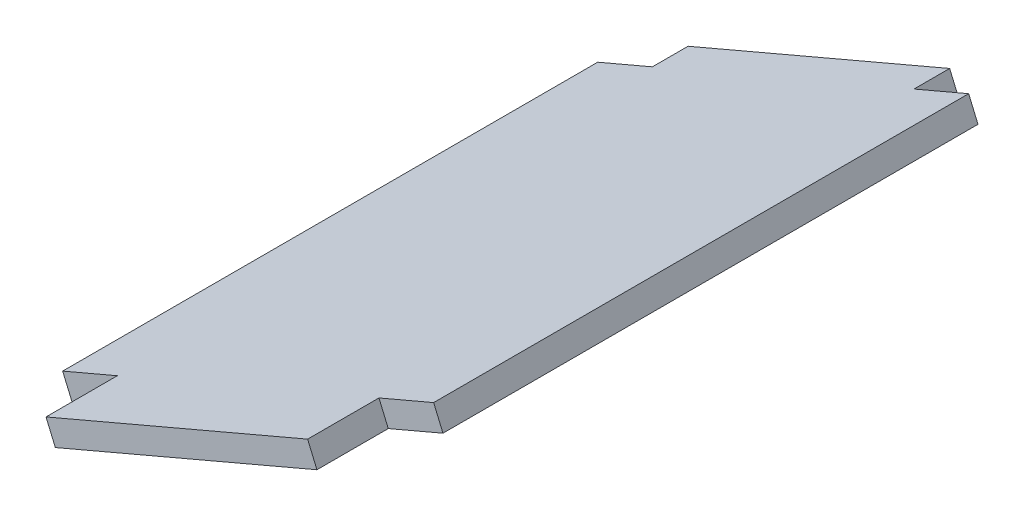
ISO-10303-21;
HEADER;
FILE_DESCRIPTION(('STEP AP214'),'2;1');
FILE_NAME('part.step','',(''),(''),'','','');
FILE_SCHEMA(('AUTOMOTIVE_DESIGN { 1 0 10303 214 1 1 1 1 }'));
ENDSEC;
DATA;
#1=APPLICATION_CONTEXT('core data for automotive mechanical design processes');
#2=APPLICATION_PROTOCOL_DEFINITION('international standard','automotive_design',2000,#1);
#3=PRODUCT_CONTEXT('',#1,'mechanical');
#4=PRODUCT('Part','Part','',(#3));
#5=PRODUCT_RELATED_PRODUCT_CATEGORY('part','',(#4));
#6=PRODUCT_DEFINITION_FORMATION('','',#4);
#7=PRODUCT_DEFINITION_CONTEXT('part definition',#1,'design');
#8=PRODUCT_DEFINITION('design','',#6,#7);
#9=PRODUCT_DEFINITION_SHAPE('','',#8);
#10=(LENGTH_UNIT() NAMED_UNIT(*) SI_UNIT(.MILLI.,.METRE.));
#11=(NAMED_UNIT(*) PLANE_ANGLE_UNIT() SI_UNIT($,.RADIAN.));
#12=(NAMED_UNIT(*) SI_UNIT($,.STERADIAN.) SOLID_ANGLE_UNIT());
#13=UNCERTAINTY_MEASURE_WITH_UNIT(LENGTH_MEASURE(1.E-05),#10,'distance_accuracy_value','');
#14=(GEOMETRIC_REPRESENTATION_CONTEXT(3) GLOBAL_UNCERTAINTY_ASSIGNED_CONTEXT((#13)) GLOBAL_UNIT_ASSIGNED_CONTEXT((#10,
#11,#12)) REPRESENTATION_CONTEXT('',''));
#15=CARTESIAN_POINT('',(0.,0.,0.));
#16=DIRECTION('',(0.,0.,1.));
#17=DIRECTION('',(1.,0.,0.));
#18=AXIS2_PLACEMENT_3D('',#15,#16,#17);
#19=CARTESIAN_POINT('',(192.83656701681,-82.6572678238072,-73.4017709703362));
#20=DIRECTION('',(0.919842012316026,0.392289016387667,0.));
#21=DIRECTION('',(-0.392289016387667,0.919842012316027,0.));
#22=AXIS2_PLACEMENT_3D('',#19,#20,#21);
#23=PLANE('',#22);
#24=DIRECTION('',(0.,0.,1.));
#25=VECTOR('',#24,1.);
#26=CARTESIAN_POINT('',(193.621145049585,-84.4969518484393,-73.4017709703362));
#27=LINE('',#26,#25);
#28=CARTESIAN_POINT('',(193.621145049587,-84.4969518484384,0.));
#29=VERTEX_POINT('',#28);
#30=CARTESIAN_POINT('',(193.621145049585,-84.4969518484393,6.));
#31=VERTEX_POINT('',#30);
#32=EDGE_CURVE('E145',#29,#31,#27,.T.);
#33=ORIENTED_EDGE('',*,*,#32,.T.);
#34=DIRECTION('',(-0.392289016387667,0.919842012316027,0.));
#35=VECTOR('',#34,1.);
#36=CARTESIAN_POINT('',(192.83656701681,-82.6572678238072,6.));
#37=LINE('',#36,#35);
#38=CARTESIAN_POINT('',(192.83656701681,-82.6572678238072,6.));
#39=VERTEX_POINT('',#38);
#40=EDGE_CURVE('E229',#31,#39,#37,.T.);
#41=ORIENTED_EDGE('',*,*,#40,.T.);
#42=DIRECTION('',(0.,0.,1.));
#43=VECTOR('',#42,1.);
#44=CARTESIAN_POINT('',(192.83656701681,-82.6572678238072,-73.4017709703362));
#45=LINE('',#44,#43);
#46=CARTESIAN_POINT('',(192.836567016812,-82.6572678238063,0.));
#47=VERTEX_POINT('',#46);
#48=EDGE_CURVE('E195',#47,#39,#45,.T.);
#49=ORIENTED_EDGE('',*,*,#48,.F.);
#50=DIRECTION('',(-0.39228901638768,0.919842012316021,0.));
#51=VECTOR('',#50,1.);
#52=CARTESIAN_POINT('',(192.836567016812,-82.6572678238063,0.));
#53=LINE('',#52,#51);
#54=EDGE_CURVE('E153',#29,#47,#53,.T.);
#55=ORIENTED_EDGE('',*,*,#54,.F.);
#56=EDGE_LOOP('',(#33,#41,#49,#55));
#57=FACE_BOUND('',#56,.T.);
#58=ADVANCED_FACE('F32',(#57),#23,.F.);
#59=CARTESIAN_POINT('',(215.624354877164,-75.1131474287005,-73.4017709703362));
#60=DIRECTION('',(-0.919842012316021,-0.392289016387678,0.));
#61=DIRECTION('',(0.392289016387678,-0.919842012316021,0.));
#62=AXIS2_PLACEMENT_3D('',#59,#60,#61);
#63=PLANE('',#62);
#64=DIRECTION('',(-0.392289016387679,0.919842012316022,0.));
#65=VECTOR('',#64,1.);
#66=CARTESIAN_POINT('',(214.839776844388,-73.2734634040683,0.));
#67=LINE('',#66,#65);
#68=CARTESIAN_POINT('',(215.624354877164,-75.1131474287005,0.));
#69=VERTEX_POINT('',#68);
#70=CARTESIAN_POINT('',(214.839776844388,-73.2734634040684,0.));
#71=VERTEX_POINT('',#70);
#72=EDGE_CURVE('E146',#69,#71,#67,.T.);
#73=ORIENTED_EDGE('',*,*,#72,.T.);
#74=DIRECTION('',(0.,0.,1.));
#75=VECTOR('',#74,1.);
#76=CARTESIAN_POINT('',(214.839776844388,-73.2734634040684,-73.4017709703362));
#77=LINE('',#76,#75);
#78=CARTESIAN_POINT('',(214.839776844388,-73.2734634040684,6.));
#79=VERTEX_POINT('',#78);
#80=EDGE_CURVE('E215',#71,#79,#77,.T.);
#81=ORIENTED_EDGE('',*,*,#80,.T.);
#82=DIRECTION('',(0.392289016387679,-0.919842012316022,0.));
#83=VECTOR('',#82,1.);
#84=CARTESIAN_POINT('',(215.624354877164,-75.1131474287005,6.));
#85=LINE('',#84,#83);
#86=CARTESIAN_POINT('',(215.624354877164,-75.1131474287005,6.));
#87=VERTEX_POINT('',#86);
#88=EDGE_CURVE('E224',#79,#87,#85,.T.);
#89=ORIENTED_EDGE('',*,*,#88,.T.);
#90=DIRECTION('',(0.,0.,1.));
#91=VECTOR('',#90,1.);
#92=CARTESIAN_POINT('',(215.624354877164,-75.1131474287005,-73.4017709703362));
#93=LINE('',#92,#91);
#94=EDGE_CURVE('E208',#69,#87,#93,.T.);
#95=ORIENTED_EDGE('',*,*,#94,.F.);
#96=EDGE_LOOP('',(#73,#81,#89,#95));
#97=FACE_BOUND('',#96,.T.);
#98=ADVANCED_FACE('F262',(#97),#63,.F.);
#99=DIRECTION('',(0.392289016387679,-0.919842012316022,0.));
#100=VECTOR('',#99,1.);
#101=CARTESIAN_POINT('',(214.839776844388,-73.2734634040683,-45.));
#102=LINE('',#101,#100);
#103=CARTESIAN_POINT('',(214.839776844388,-73.2734634040684,-45.));
#104=VERTEX_POINT('',#103);
#105=CARTESIAN_POINT('',(215.624354877164,-75.1131474287004,-45.));
#106=VERTEX_POINT('',#105);
#107=EDGE_CURVE('E148',#104,#106,#102,.T.);
#108=ORIENTED_EDGE('',*,*,#107,.T.);
#109=CARTESIAN_POINT('',(215.624354877164,-75.1131474287005,-48.));
#110=VERTEX_POINT('',#109);
#111=EDGE_CURVE('E205',#110,#106,#93,.T.);
#112=ORIENTED_EDGE('',*,*,#111,.F.);
#113=DIRECTION('',(-0.392289016387678,0.919842012316021,0.));
#114=VECTOR('',#113,1.);
#115=CARTESIAN_POINT('',(215.624354877164,-75.1131474287005,-48.));
#116=LINE('',#115,#114);
#117=CARTESIAN_POINT('',(214.839776844388,-73.2734634040684,-48.));
#118=VERTEX_POINT('',#117);
#119=EDGE_CURVE('E192',#110,#118,#116,.T.);
#120=ORIENTED_EDGE('',*,*,#119,.T.);
#121=EDGE_CURVE('E212',#118,#104,#77,.T.);
#122=ORIENTED_EDGE('',*,*,#121,.T.);
#123=EDGE_LOOP('',(#108,#112,#120,#122));
#124=FACE_BOUND('',#123,.T.);
#125=ADVANCED_FACE('F270',(#124),#63,.F.);
#126=CARTESIAN_POINT('',(214.839776844388,-73.2734634040684,-73.4017709703362));
#127=DIRECTION('',(0.392289016387681,-0.919842012316021,0.));
#128=DIRECTION('',(0.919842012316021,0.392289016387681,0.));
#129=AXIS2_PLACEMENT_3D('',#126,#127,#128);
#130=PLANE('',#129);
#131=DIRECTION('',(-0.919842012316021,-0.392289016387681,0.));
#132=VECTOR('',#131,1.);
#133=CARTESIAN_POINT('',(214.839776844388,-73.2734634040684,-48.));
#134=LINE('',#133,#132);
#135=CARTESIAN_POINT('',(192.83656701681,-82.6572678238072,-48.));
#136=VERTEX_POINT('',#135);
#137=EDGE_CURVE('E41',#118,#136,#134,.T.);
#138=ORIENTED_EDGE('',*,*,#137,.T.);
#139=CARTESIAN_POINT('',(192.836567016812,-82.6572678238063,-45.));
#140=VERTEX_POINT('',#139);
#141=EDGE_CURVE('E184',#136,#140,#45,.T.);
#142=ORIENTED_EDGE('',*,*,#141,.T.);
#143=DIRECTION('',(0.919842012316021,0.392289016387679,0.));
#144=VECTOR('',#143,1.);
#145=CARTESIAN_POINT('',(188.237356955232,-84.6187129057447,-45.));
#146=LINE('',#145,#144);
#147=CARTESIAN_POINT('',(188.237356955232,-84.6187129057447,-45.));
#148=VERTEX_POINT('',#147);
#149=EDGE_CURVE('E150',#148,#140,#146,.T.);
#150=ORIENTED_EDGE('',*,*,#149,.F.);
#151=DIRECTION('',(0.,0.,-1.));
#152=VECTOR('',#151,1.);
#153=CARTESIAN_POINT('',(188.237356955232,-84.6187129057447,0.));
#154=LINE('',#153,#152);
#155=CARTESIAN_POINT('',(188.237356955232,-84.6187129057447,0.));
#156=VERTEX_POINT('',#155);
#157=EDGE_CURVE('E161',#156,#148,#154,.T.);
#158=ORIENTED_EDGE('',*,*,#157,.F.);
#159=DIRECTION('',(0.919842012316021,0.392289016387679,0.));
#160=VECTOR('',#159,1.);
#161=CARTESIAN_POINT('',(188.237356955232,-84.6187129057447,0.));
#162=LINE('',#161,#160);
#163=EDGE_CURVE('E132',#156,#47,#162,.T.);
#164=ORIENTED_EDGE('',*,*,#163,.T.);
#165=ORIENTED_EDGE('',*,*,#48,.T.);
#166=DIRECTION('',(0.919842012316021,0.392289016387681,0.));
#167=VECTOR('',#166,1.);
#168=CARTESIAN_POINT('',(214.839776844388,-73.2734634040684,6.));
#169=LINE('',#168,#167);
#170=EDGE_CURVE('E211',#39,#79,#169,.T.);
#171=ORIENTED_EDGE('',*,*,#170,.T.);
#172=ORIENTED_EDGE('',*,*,#80,.F.);
#173=DIRECTION('',(-0.919842012316021,-0.39228901638768,0.));
#174=VECTOR('',#173,1.);
#175=CARTESIAN_POINT('',(219.438986905969,-71.3120183221299,0.));
#176=LINE('',#175,#174);
#177=CARTESIAN_POINT('',(219.438986905969,-71.3120183221299,0.));
#178=VERTEX_POINT('',#177);
#179=EDGE_CURVE('E57',#178,#71,#176,.T.);
#180=ORIENTED_EDGE('',*,*,#179,.F.);
#181=DIRECTION('',(0.,0.,-1.));
#182=VECTOR('',#181,1.);
#183=CARTESIAN_POINT('',(219.438986905969,-71.3120183221299,0.));
#184=LINE('',#183,#182);
#185=CARTESIAN_POINT('',(219.438986905969,-71.3120183221299,-45.));
#186=VERTEX_POINT('',#185);
#187=EDGE_CURVE('E280',#178,#186,#184,.T.);
#188=ORIENTED_EDGE('',*,*,#187,.T.);
#189=DIRECTION('',(-0.919842012316021,-0.39228901638768,0.));
#190=VECTOR('',#189,1.);
#191=CARTESIAN_POINT('',(219.438986905969,-71.3120183221299,-45.));
#192=LINE('',#191,#190);
#193=EDGE_CURVE('E240',#186,#104,#192,.T.);
#194=ORIENTED_EDGE('',*,*,#193,.T.);
#195=ORIENTED_EDGE('',*,*,#121,.F.);
#196=EDGE_LOOP('',(#138,#142,#150,#158,#164,#165,#171,#172,#180,#188,#194,#195));
#197=FACE_BOUND('',#196,.T.);
#198=ADVANCED_FACE('F182',(#197),#130,.F.);
#199=ORIENTED_EDGE('',*,*,#141,.F.);
#200=DIRECTION('',(0.392289016387667,-0.919842012316027,0.));
#201=VECTOR('',#200,1.);
#202=CARTESIAN_POINT('',(192.83656701681,-82.6572678238072,-48.));
#203=LINE('',#202,#201);
#204=CARTESIAN_POINT('',(193.621145049585,-84.4969518484393,-48.));
#205=VERTEX_POINT('',#204);
#206=EDGE_CURVE('E11',#136,#205,#203,.T.);
#207=ORIENTED_EDGE('',*,*,#206,.T.);
#208=CARTESIAN_POINT('',(193.621145049585,-84.4969518484393,-45.));
#209=VERTEX_POINT('',#208);
#210=EDGE_CURVE('E189',#205,#209,#27,.T.);
#211=ORIENTED_EDGE('',*,*,#210,.T.);
#212=DIRECTION('',(0.39228901638768,-0.919842012316021,0.));
#213=VECTOR('',#212,1.);
#214=CARTESIAN_POINT('',(192.836567016812,-82.6572678238063,-45.));
#215=LINE('',#214,#213);
#216=EDGE_CURVE('E137',#140,#209,#215,.T.);
#217=ORIENTED_EDGE('',*,*,#216,.F.);
#218=EDGE_LOOP('',(#199,#207,#211,#217));
#219=FACE_BOUND('',#218,.T.);
#220=ADVANCED_FACE('F190',(#219),#23,.F.);
#221=CARTESIAN_POINT('',(193.621145049585,-84.4969518484393,-73.4017709703362));
#222=DIRECTION('',(-0.39228901638768,0.919842012316021,0.));
#223=DIRECTION('',(-0.919842012316021,-0.39228901638768,0.));
#224=AXIS2_PLACEMENT_3D('',#221,#222,#223);
#225=PLANE('',#224);
#226=DIRECTION('',(0.919842012316021,0.39228901638768,0.));
#227=VECTOR('',#226,1.);
#228=CARTESIAN_POINT('',(193.621145049585,-84.4969518484393,-48.));
#229=LINE('',#228,#227);
#230=EDGE_CURVE('E191',#205,#110,#229,.T.);
#231=ORIENTED_EDGE('',*,*,#230,.T.);
#232=ORIENTED_EDGE('',*,*,#111,.T.);
#233=DIRECTION('',(-0.919842012316021,-0.39228901638768,0.));
#234=VECTOR('',#233,1.);
#235=CARTESIAN_POINT('',(220.223564938744,-73.151702346762,-45.));
#236=LINE('',#235,#234);
#237=CARTESIAN_POINT('',(220.223564938744,-73.151702346762,-45.));
#238=VERTEX_POINT('',#237);
#239=EDGE_CURVE('E238',#238,#106,#236,.T.);
#240=ORIENTED_EDGE('',*,*,#239,.F.);
#241=DIRECTION('',(0.,0.,1.));
#242=VECTOR('',#241,1.);
#243=CARTESIAN_POINT('',(220.223564938744,-73.151702346762,0.));
#244=LINE('',#243,#242);
#245=CARTESIAN_POINT('',(220.223564938744,-73.151702346762,0.));
#246=VERTEX_POINT('',#245);
#247=EDGE_CURVE('E251',#238,#246,#244,.T.);
#248=ORIENTED_EDGE('',*,*,#247,.T.);
#249=DIRECTION('',(-0.919842012316021,-0.39228901638768,0.));
#250=VECTOR('',#249,1.);
#251=CARTESIAN_POINT('',(220.223564938744,-73.151702346762,0.));
#252=LINE('',#251,#250);
#253=EDGE_CURVE('E241',#246,#69,#252,.T.);
#254=ORIENTED_EDGE('',*,*,#253,.T.);
#255=ORIENTED_EDGE('',*,*,#94,.T.);
#256=DIRECTION('',(-0.919842012316021,-0.39228901638768,0.));
#257=VECTOR('',#256,1.);
#258=CARTESIAN_POINT('',(193.621145049585,-84.4969518484393,6.));
#259=LINE('',#258,#257);
#260=EDGE_CURVE('E227',#87,#31,#259,.T.);
#261=ORIENTED_EDGE('',*,*,#260,.T.);
#262=ORIENTED_EDGE('',*,*,#32,.F.);
#263=DIRECTION('',(0.919842012316021,0.392289016387679,0.));
#264=VECTOR('',#263,1.);
#265=CARTESIAN_POINT('',(189.021934988007,-86.4583969303768,0.));
#266=LINE('',#265,#264);
#267=CARTESIAN_POINT('',(189.021934988007,-86.4583969303768,0.));
#268=VERTEX_POINT('',#267);
#269=EDGE_CURVE('E130',#268,#29,#266,.T.);
#270=ORIENTED_EDGE('',*,*,#269,.F.);
#271=DIRECTION('',(0.,0.,1.));
#272=VECTOR('',#271,1.);
#273=CARTESIAN_POINT('',(189.021934988007,-86.4583969303768,0.));
#274=LINE('',#273,#272);
#275=CARTESIAN_POINT('',(189.021934988007,-86.4583969303768,-45.));
#276=VERTEX_POINT('',#275);
#277=EDGE_CURVE('E136',#276,#268,#274,.T.);
#278=ORIENTED_EDGE('',*,*,#277,.F.);
#279=DIRECTION('',(0.919842012316021,0.392289016387679,0.));
#280=VECTOR('',#279,1.);
#281=CARTESIAN_POINT('',(189.021934988007,-86.4583969303768,-45.));
#282=LINE('',#281,#280);
#283=EDGE_CURVE('E49',#276,#209,#282,.T.);
#284=ORIENTED_EDGE('',*,*,#283,.T.);
#285=ORIENTED_EDGE('',*,*,#210,.F.);
#286=EDGE_LOOP('',(#231,#232,#240,#248,#254,#255,#261,#262,#270,#278,#284,#285));
#287=FACE_BOUND('',#286,.T.);
#288=ADVANCED_FACE('F143',(#287),#225,.F.);
#289=CARTESIAN_POINT('',(0.,0.,-48.));
#290=DIRECTION('',(0.,0.,-1.));
#291=DIRECTION('',(0.,-1.,0.));
#292=AXIS2_PLACEMENT_3D('',#289,#290,#291);
#293=PLANE('',#292);
#294=ORIENTED_EDGE('',*,*,#230,.F.);
#295=ORIENTED_EDGE('',*,*,#206,.F.);
#296=ORIENTED_EDGE('',*,*,#137,.F.);
#297=ORIENTED_EDGE('',*,*,#119,.F.);
#298=EDGE_LOOP('',(#294,#295,#296,#297));
#299=FACE_BOUND('',#298,.T.);
#300=ADVANCED_FACE('F34',(#299),#293,.T.);
#301=CARTESIAN_POINT('',(0.,0.,6.));
#302=DIRECTION('',(0.,0.,-1.));
#303=DIRECTION('',(0.,-1.,0.));
#304=AXIS2_PLACEMENT_3D('',#301,#302,#303);
#305=PLANE('',#304);
#306=ORIENTED_EDGE('',*,*,#88,.F.);
#307=ORIENTED_EDGE('',*,*,#170,.F.);
#308=ORIENTED_EDGE('',*,*,#40,.F.);
#309=ORIENTED_EDGE('',*,*,#260,.F.);
#310=EDGE_LOOP('',(#306,#307,#308,#309));
#311=FACE_BOUND('',#310,.T.);
#312=ADVANCED_FACE('F258',(#311),#305,.F.);
#313=CARTESIAN_POINT('',(219.438986905969,-71.3120183221299,0.));
#314=DIRECTION('',(0.,0.,-1.));
#315=DIRECTION('',(0.,-1.,0.));
#316=AXIS2_PLACEMENT_3D('',#313,#314,#315);
#317=PLANE('',#316);
#318=ORIENTED_EDGE('',*,*,#72,.F.);
#319=ORIENTED_EDGE('',*,*,#253,.F.);
#320=DIRECTION('',(-0.392289016387679,0.919842012316022,0.));
#321=VECTOR('',#320,1.);
#322=CARTESIAN_POINT('',(219.438986905969,-71.3120183221299,0.));
#323=LINE('',#322,#321);
#324=EDGE_CURVE('E165',#246,#178,#323,.T.);
#325=ORIENTED_EDGE('',*,*,#324,.T.);
#326=ORIENTED_EDGE('',*,*,#179,.T.);
#327=EDGE_LOOP('',(#318,#319,#325,#326));
#328=FACE_BOUND('',#327,.T.);
#329=ADVANCED_FACE('F284',(#328),#317,.F.);
#330=CARTESIAN_POINT('',(219.438986905969,-71.3120183221299,-45.));
#331=DIRECTION('',(0.,0.,1.));
#332=DIRECTION('',(-1.,0.,0.));
#333=AXIS2_PLACEMENT_3D('',#330,#331,#332);
#334=PLANE('',#333);
#335=ORIENTED_EDGE('',*,*,#107,.F.);
#336=ORIENTED_EDGE('',*,*,#193,.F.);
#337=DIRECTION('',(0.392289016387679,-0.919842012316022,0.));
#338=VECTOR('',#337,1.);
#339=CARTESIAN_POINT('',(219.438986905969,-71.3120183221299,-45.));
#340=LINE('',#339,#338);
#341=EDGE_CURVE('E276',#186,#238,#340,.T.);
#342=ORIENTED_EDGE('',*,*,#341,.T.);
#343=ORIENTED_EDGE('',*,*,#239,.T.);
#344=EDGE_LOOP('',(#335,#336,#342,#343));
#345=FACE_BOUND('',#344,.T.);
#346=ADVANCED_FACE('F274',(#345),#334,.F.);
#347=CARTESIAN_POINT('',(159.936865555761,68.2089694022828,0.));
#348=DIRECTION('',(-0.919842012316021,-0.392289016387678,0.));
#349=DIRECTION('',(0.392289016387678,-0.919842012316021,0.));
#350=AXIS2_PLACEMENT_3D('',#347,#348,#349);
#351=PLANE('',#350);
#352=ORIENTED_EDGE('',*,*,#324,.F.);
#353=ORIENTED_EDGE('',*,*,#247,.F.);
#354=ORIENTED_EDGE('',*,*,#341,.F.);
#355=ORIENTED_EDGE('',*,*,#187,.F.);
#356=EDGE_LOOP('',(#352,#353,#354,#355));
#357=FACE_BOUND('',#356,.T.);
#358=ADVANCED_FACE('F282',(#357),#351,.F.);
#359=CARTESIAN_POINT('',(188.237356955232,-84.6187129057447,0.));
#360=DIRECTION('',(0.,0.,1.));
#361=DIRECTION('',(0.,1.,0.));
#362=AXIS2_PLACEMENT_3D('',#359,#360,#361);
#363=PLANE('',#362);
#364=ORIENTED_EDGE('',*,*,#54,.T.);
#365=ORIENTED_EDGE('',*,*,#163,.F.);
#366=DIRECTION('',(-0.39228901638768,0.919842012316021,0.));
#367=VECTOR('',#366,1.);
#368=CARTESIAN_POINT('',(188.237356955232,-84.6187129057447,0.));
#369=LINE('',#368,#367);
#370=EDGE_CURVE('E125',#268,#156,#369,.T.);
#371=ORIENTED_EDGE('',*,*,#370,.F.);
#372=ORIENTED_EDGE('',*,*,#269,.T.);
#373=EDGE_LOOP('',(#364,#365,#371,#372));
#374=FACE_BOUND('',#373,.T.);
#375=ADVANCED_FACE('F128',(#374),#363,.T.);
#376=CARTESIAN_POINT('',(188.237356955232,-84.6187129057447,-45.));
#377=DIRECTION('',(0.,0.,-1.));
#378=DIRECTION('',(1.,0.,0.));
#379=AXIS2_PLACEMENT_3D('',#376,#377,#378);
#380=PLANE('',#379);
#381=ORIENTED_EDGE('',*,*,#216,.T.);
#382=ORIENTED_EDGE('',*,*,#283,.F.);
#383=DIRECTION('',(0.39228901638768,-0.919842012316021,0.));
#384=VECTOR('',#383,1.);
#385=CARTESIAN_POINT('',(188.237356955232,-84.6187129057447,-45.));
#386=LINE('',#385,#384);
#387=EDGE_CURVE('E140',#148,#276,#386,.T.);
#388=ORIENTED_EDGE('',*,*,#387,.F.);
#389=ORIENTED_EDGE('',*,*,#149,.T.);
#390=EDGE_LOOP('',(#381,#382,#388,#389));
#391=FACE_BOUND('',#390,.T.);
#392=ADVANCED_FACE('F186',(#391),#380,.T.);
#393=CARTESIAN_POINT('',(128.735235605024,54.902274818668,0.));
#394=DIRECTION('',(0.919842012316021,0.39228901638768,0.));
#395=DIRECTION('',(0.39228901638768,-0.919842012316021,0.));
#396=AXIS2_PLACEMENT_3D('',#393,#394,#395);
#397=PLANE('',#396);
#398=ORIENTED_EDGE('',*,*,#370,.T.);
#399=ORIENTED_EDGE('',*,*,#157,.T.);
#400=ORIENTED_EDGE('',*,*,#387,.T.);
#401=ORIENTED_EDGE('',*,*,#277,.T.);
#402=EDGE_LOOP('',(#398,#399,#400,#401));
#403=FACE_BOUND('',#402,.T.);
#404=ADVANCED_FACE('F139',(#403),#397,.F.);
#405=CLOSED_SHELL('',(#58,#98,#125,#198,#220,#288,#300,#312,#329,#346,#358,#375,#392,#404));
#406=MANIFOLD_SOLID_BREP('B2',#405);
#407=ADVANCED_BREP_SHAPE_REPRESENTATION('',(#18,#406),#14);
#408=SHAPE_DEFINITION_REPRESENTATION(#9,#407);
ENDSEC;
END-ISO-10303-21;
